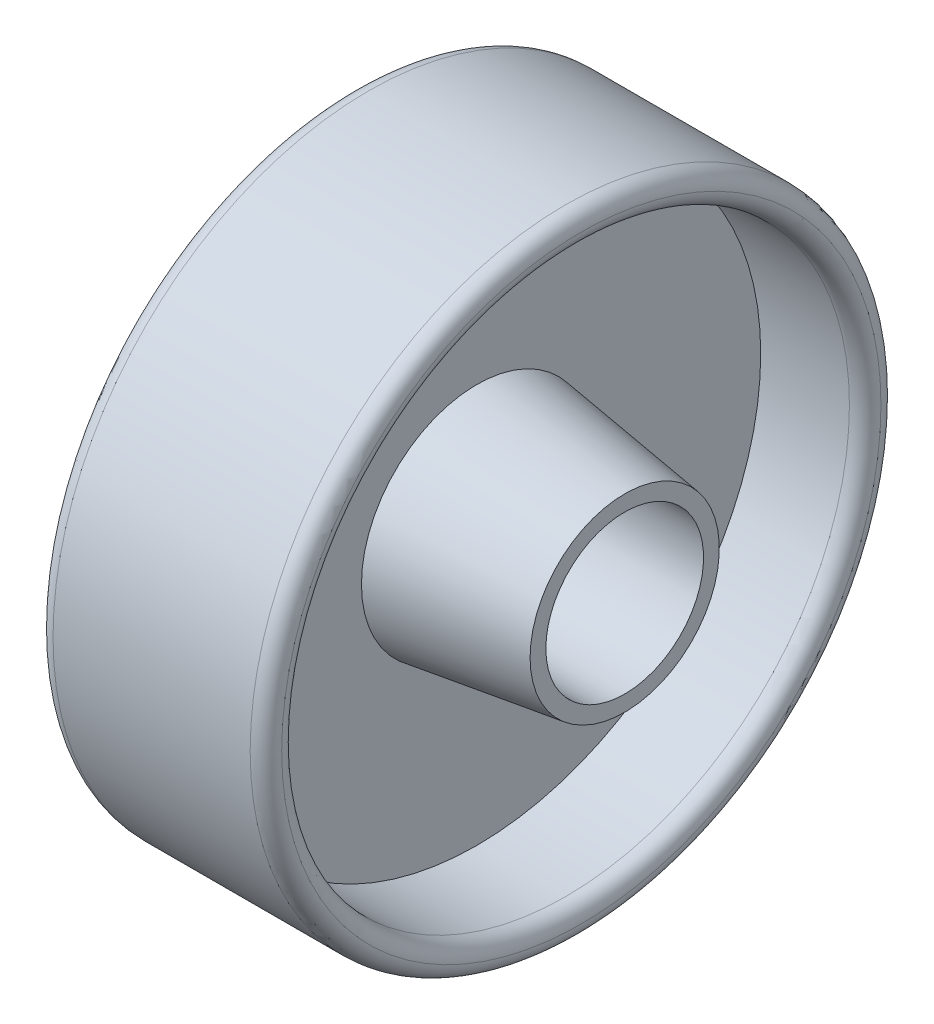
ISO-10303-21;
HEADER;
FILE_DESCRIPTION(('STEP AP214'),'2;1');
FILE_NAME('part.step','',(''),(''),'','','');
FILE_SCHEMA(('AUTOMOTIVE_DESIGN { 1 0 10303 214 1 1 1 1 }'));
ENDSEC;
DATA;
#1=APPLICATION_CONTEXT('core data for automotive mechanical design processes');
#2=APPLICATION_PROTOCOL_DEFINITION('international standard','automotive_design',2000,#1);
#3=PRODUCT_CONTEXT('',#1,'mechanical');
#4=PRODUCT('Part','Part','',(#3));
#5=PRODUCT_RELATED_PRODUCT_CATEGORY('part','',(#4));
#6=PRODUCT_DEFINITION_FORMATION('','',#4);
#7=PRODUCT_DEFINITION_CONTEXT('part definition',#1,'design');
#8=PRODUCT_DEFINITION('design','',#6,#7);
#9=PRODUCT_DEFINITION_SHAPE('','',#8);
#10=(LENGTH_UNIT() NAMED_UNIT(*) SI_UNIT(.MILLI.,.METRE.));
#11=(NAMED_UNIT(*) PLANE_ANGLE_UNIT() SI_UNIT($,.RADIAN.));
#12=(NAMED_UNIT(*) SI_UNIT($,.STERADIAN.) SOLID_ANGLE_UNIT());
#13=UNCERTAINTY_MEASURE_WITH_UNIT(LENGTH_MEASURE(1.E-05),#10,'distance_accuracy_value','');
#14=(GEOMETRIC_REPRESENTATION_CONTEXT(3) GLOBAL_UNCERTAINTY_ASSIGNED_CONTEXT((#13)) GLOBAL_UNIT_ASSIGNED_CONTEXT((#10,
#11,#12)) REPRESENTATION_CONTEXT('',''));
#15=CARTESIAN_POINT('',(0.,0.,0.));
#16=DIRECTION('',(0.,0.,1.));
#17=DIRECTION('',(1.,0.,0.));
#18=AXIS2_PLACEMENT_3D('',#15,#16,#17);
#19=CARTESIAN_POINT('',(20.,10.,0.));
#20=DIRECTION('',(-1.,0.,0.));
#21=DIRECTION('',(0.,0.,1.));
#22=AXIS2_PLACEMENT_3D('',#19,#20,#21);
#23=PLANE('',#22);
#24=CARTESIAN_POINT('',(20.,0.,0.));
#25=DIRECTION('',(-1.,0.,0.));
#26=DIRECTION('',(0.,0.,1.));
#27=AXIS2_PLACEMENT_3D('',#24,#25,#26);
#28=CIRCLE('',#27,12.);
#29=CARTESIAN_POINT('',(20.,0.,12.));
#30=VERTEX_POINT('',#29);
#31=EDGE_CURVE('E49',#30,#30,#28,.T.);
#32=ORIENTED_EDGE('',*,*,#31,.F.);
#33=EDGE_LOOP('',(#32));
#34=FACE_BOUND('',#33,.T.);
#35=CARTESIAN_POINT('',(20.,0.,0.));
#36=DIRECTION('',(-1.,0.,0.));
#37=DIRECTION('',(0.,0.,1.));
#38=AXIS2_PLACEMENT_3D('',#35,#36,#37);
#39=CIRCLE('',#38,10.);
#40=CARTESIAN_POINT('',(20.,0.,10.));
#41=VERTEX_POINT('',#40);
#42=EDGE_CURVE('E135',#41,#41,#39,.T.);
#43=ORIENTED_EDGE('',*,*,#42,.T.);
#44=EDGE_LOOP('',(#43));
#45=FACE_BOUND('',#44,.T.);
#46=ADVANCED_FACE('F31',(#34,#45),#23,.F.);
#47=CARTESIAN_POINT('',(0.,0.,0.));
#48=DIRECTION('',(-1.,0.,0.));
#49=DIRECTION('',(0.,0.,1.));
#50=AXIS2_PLACEMENT_3D('',#47,#48,#49);
#51=CYLINDRICAL_SURFACE('',#50,10.);
#52=ORIENTED_EDGE('',*,*,#42,.F.);
#53=EDGE_LOOP('',(#52));
#54=FACE_BOUND('',#53,.T.);
#55=CARTESIAN_POINT('',(-20.,0.,0.));
#56=DIRECTION('',(-1.,0.,0.));
#57=DIRECTION('',(0.,0.,1.));
#58=AXIS2_PLACEMENT_3D('',#55,#56,#57);
#59=CIRCLE('',#58,10.);
#60=CARTESIAN_POINT('',(-20.,0.,10.));
#61=VERTEX_POINT('',#60);
#62=EDGE_CURVE('E129',#61,#61,#59,.T.);
#63=ORIENTED_EDGE('',*,*,#62,.T.);
#64=EDGE_LOOP('',(#63));
#65=FACE_BOUND('',#64,.T.);
#66=ADVANCED_FACE('F73',(#54,#65),#51,.F.);
#67=CARTESIAN_POINT('',(-20.,10.,0.));
#68=DIRECTION('',(1.,0.,0.));
#69=DIRECTION('',(0.,0.,-1.));
#70=AXIS2_PLACEMENT_3D('',#67,#68,#69);
#71=PLANE('',#70);
#72=ORIENTED_EDGE('',*,*,#62,.F.);
#73=EDGE_LOOP('',(#72));
#74=FACE_BOUND('',#73,.T.);
#75=CARTESIAN_POINT('',(-20.,0.,0.));
#76=DIRECTION('',(-1.,0.,0.));
#77=DIRECTION('',(0.,0.,1.));
#78=AXIS2_PLACEMENT_3D('',#75,#76,#77);
#79=CIRCLE('',#78,12.);
#80=CARTESIAN_POINT('',(-20.,0.,12.));
#81=VERTEX_POINT('',#80);
#82=EDGE_CURVE('E132',#81,#81,#79,.T.);
#83=ORIENTED_EDGE('',*,*,#82,.T.);
#84=EDGE_LOOP('',(#83));
#85=FACE_BOUND('',#84,.T.);
#86=ADVANCED_FACE('F79',(#74,#85),#71,.F.);
#87=CARTESIAN_POINT('',(-1.25,0.,0.));
#88=DIRECTION('',(1.,0.,0.));
#89=DIRECTION('',(0.,0.,-1.));
#90=AXIS2_PLACEMENT_3D('',#87,#88,#89);
#91=CONICAL_SURFACE('',#90,14.6351406506697,0.139626340159539);
#92=ORIENTED_EDGE('',*,*,#82,.F.);
#93=EDGE_LOOP('',(#92));
#94=FACE_BOUND('',#93,.T.);
#95=CARTESIAN_POINT('',(-1.25,0.,0.));
#96=DIRECTION('',(-1.,0.,0.));
#97=DIRECTION('',(0.,0.,1.));
#98=AXIS2_PLACEMENT_3D('',#95,#96,#97);
#99=CIRCLE('',#98,14.6351406506697);
#100=CARTESIAN_POINT('',(-1.25,0.,14.6351406506697));
#101=VERTEX_POINT('',#100);
#102=EDGE_CURVE('E133',#101,#101,#99,.T.);
#103=ORIENTED_EDGE('',*,*,#102,.T.);
#104=EDGE_LOOP('',(#103));
#105=FACE_BOUND('',#104,.T.);
#106=ADVANCED_FACE('F118',(#94,#105),#91,.T.);
#107=CARTESIAN_POINT('',(-1.25,14.6351406506697,0.));
#108=DIRECTION('',(1.,0.,0.));
#109=DIRECTION('',(0.,0.,-1.));
#110=AXIS2_PLACEMENT_3D('',#107,#108,#109);
#111=PLANE('',#110);
#112=ORIENTED_EDGE('',*,*,#102,.F.);
#113=EDGE_LOOP('',(#112));
#114=FACE_BOUND('',#113,.T.);
#115=CARTESIAN_POINT('',(-1.25,0.,0.));
#116=DIRECTION('',(-1.,0.,0.));
#117=DIRECTION('',(0.,0.,1.));
#118=AXIS2_PLACEMENT_3D('',#115,#116,#117);
#119=CIRCLE('',#118,36.);
#120=CARTESIAN_POINT('',(-1.25,0.,36.));
#121=VERTEX_POINT('',#120);
#122=EDGE_CURVE('E138',#121,#121,#119,.T.);
#123=ORIENTED_EDGE('',*,*,#122,.T.);
#124=EDGE_LOOP('',(#123));
#125=FACE_BOUND('',#124,.T.);
#126=ADVANCED_FACE('F114',(#114,#125),#111,.F.);
#127=CARTESIAN_POINT('',(0.,0.,0.));
#128=DIRECTION('',(-1.,0.,0.));
#129=DIRECTION('',(0.,0.,1.));
#130=AXIS2_PLACEMENT_3D('',#127,#128,#129);
#131=CYLINDRICAL_SURFACE('',#130,36.);
#132=CARTESIAN_POINT('',(-12.5,0.,0.));
#133=DIRECTION('',(1.,0.,0.));
#134=DIRECTION('',(0.,0.,-1.));
#135=AXIS2_PLACEMENT_3D('',#132,#133,#134);
#136=CIRCLE('',#135,36.);
#137=CARTESIAN_POINT('',(-12.5,0.,-36.));
#138=VERTEX_POINT('',#137);
#139=EDGE_CURVE('E44',#138,#138,#136,.F.);
#140=ORIENTED_EDGE('',*,*,#139,.T.);
#141=EDGE_LOOP('',(#140));
#142=FACE_BOUND('',#141,.T.);
#143=ORIENTED_EDGE('',*,*,#122,.F.);
#144=EDGE_LOOP('',(#143));
#145=FACE_BOUND('',#144,.T.);
#146=ADVANCED_FACE('F111',(#142,#145),#131,.F.);
#147=CARTESIAN_POINT('',(0.,0.,0.));
#148=DIRECTION('',(-1.,0.,0.));
#149=DIRECTION('',(0.,0.,1.));
#150=AXIS2_PLACEMENT_3D('',#147,#148,#149);
#151=CYLINDRICAL_SURFACE('',#150,40.);
#152=CARTESIAN_POINT('',(12.5,0.,0.));
#153=DIRECTION('',(-1.,0.,0.));
#154=DIRECTION('',(0.,0.,1.));
#155=AXIS2_PLACEMENT_3D('',#152,#153,#154);
#156=CIRCLE('',#155,40.);
#157=CARTESIAN_POINT('',(12.5,0.,40.));
#158=VERTEX_POINT('',#157);
#159=EDGE_CURVE('E10',#158,#158,#156,.T.);
#160=ORIENTED_EDGE('',*,*,#159,.T.);
#161=EDGE_LOOP('',(#160));
#162=FACE_BOUND('',#161,.T.);
#163=CARTESIAN_POINT('',(-12.5,0.,0.));
#164=DIRECTION('',(1.,0.,0.));
#165=DIRECTION('',(0.,0.,-1.));
#166=AXIS2_PLACEMENT_3D('',#163,#164,#165);
#167=CIRCLE('',#166,40.);
#168=CARTESIAN_POINT('',(-12.5,0.,-40.));
#169=VERTEX_POINT('',#168);
#170=EDGE_CURVE('E39',#169,#169,#167,.T.);
#171=ORIENTED_EDGE('',*,*,#170,.T.);
#172=EDGE_LOOP('',(#171));
#173=FACE_BOUND('',#172,.T.);
#174=ADVANCED_FACE('F107',(#162,#173),#151,.T.);
#175=CARTESIAN_POINT('',(0.,0.,0.));
#176=DIRECTION('',(-1.,0.,0.));
#177=DIRECTION('',(0.,0.,1.));
#178=AXIS2_PLACEMENT_3D('',#175,#176,#177);
#179=CYLINDRICAL_SURFACE('',#178,36.);
#180=CARTESIAN_POINT('',(12.5,0.,0.));
#181=DIRECTION('',(-1.,0.,0.));
#182=DIRECTION('',(0.,0.,1.));
#183=AXIS2_PLACEMENT_3D('',#180,#181,#182);
#184=CIRCLE('',#183,36.);
#185=CARTESIAN_POINT('',(12.5,0.,36.));
#186=VERTEX_POINT('',#185);
#187=EDGE_CURVE('E144',#186,#186,#184,.F.);
#188=ORIENTED_EDGE('',*,*,#187,.T.);
#189=EDGE_LOOP('',(#188));
#190=FACE_BOUND('',#189,.T.);
#191=CARTESIAN_POINT('',(1.25,0.,0.));
#192=DIRECTION('',(-1.,0.,0.));
#193=DIRECTION('',(0.,0.,1.));
#194=AXIS2_PLACEMENT_3D('',#191,#192,#193);
#195=CIRCLE('',#194,36.);
#196=CARTESIAN_POINT('',(1.25,0.,36.));
#197=VERTEX_POINT('',#196);
#198=EDGE_CURVE('E152',#197,#197,#195,.T.);
#199=ORIENTED_EDGE('',*,*,#198,.T.);
#200=EDGE_LOOP('',(#199));
#201=FACE_BOUND('',#200,.T.);
#202=ADVANCED_FACE('F99',(#190,#201),#179,.F.);
#203=CARTESIAN_POINT('',(1.25,14.6351406506697,0.));
#204=DIRECTION('',(-1.,0.,0.));
#205=DIRECTION('',(0.,0.,1.));
#206=AXIS2_PLACEMENT_3D('',#203,#204,#205);
#207=PLANE('',#206);
#208=ORIENTED_EDGE('',*,*,#198,.F.);
#209=EDGE_LOOP('',(#208));
#210=FACE_BOUND('',#209,.T.);
#211=CARTESIAN_POINT('',(1.25,0.,0.));
#212=DIRECTION('',(-1.,0.,0.));
#213=DIRECTION('',(0.,0.,1.));
#214=AXIS2_PLACEMENT_3D('',#211,#212,#213);
#215=CIRCLE('',#214,14.6351406506697);
#216=CARTESIAN_POINT('',(1.25,0.,14.6351406506697));
#217=VERTEX_POINT('',#216);
#218=EDGE_CURVE('E53',#217,#217,#215,.T.);
#219=ORIENTED_EDGE('',*,*,#218,.T.);
#220=EDGE_LOOP('',(#219));
#221=FACE_BOUND('',#220,.T.);
#222=ADVANCED_FACE('F92',(#210,#221),#207,.F.);
#223=CARTESIAN_POINT('',(20.,0.,0.));
#224=DIRECTION('',(-1.,0.,0.));
#225=DIRECTION('',(0.,0.,1.));
#226=AXIS2_PLACEMENT_3D('',#223,#224,#225);
#227=CONICAL_SURFACE('',#226,12.,0.139626340159539);
#228=ORIENTED_EDGE('',*,*,#218,.F.);
#229=EDGE_LOOP('',(#228));
#230=FACE_BOUND('',#229,.T.);
#231=ORIENTED_EDGE('',*,*,#31,.T.);
#232=EDGE_LOOP('',(#231));
#233=FACE_BOUND('',#232,.T.);
#234=ADVANCED_FACE('F87',(#230,#233),#227,.T.);
#235=CARTESIAN_POINT('',(12.5,0.,0.));
#236=DIRECTION('',(-1.,0.,0.));
#237=DIRECTION('',(0.,0.,1.));
#238=AXIS2_PLACEMENT_3D('',#235,#236,#237);
#239=TOROIDAL_SURFACE('',#238,38.,2.);
#240=ORIENTED_EDGE('',*,*,#159,.F.);
#241=EDGE_LOOP('',(#240));
#242=FACE_BOUND('',#241,.T.);
#243=CARTESIAN_POINT('',(14.5,0.,0.));
#244=DIRECTION('',(-1.,0.,0.));
#245=DIRECTION('',(0.,0.,1.));
#246=AXIS2_PLACEMENT_3D('',#243,#244,#245);
#247=CIRCLE('',#246,38.);
#248=CARTESIAN_POINT('',(14.5,0.,38.));
#249=VERTEX_POINT('',#248);
#250=EDGE_CURVE('E47',#249,#249,#247,.F.);
#251=ORIENTED_EDGE('',*,*,#250,.F.);
#252=EDGE_LOOP('',(#251));
#253=FACE_BOUND('',#252,.T.);
#254=ADVANCED_FACE('F68',(#242,#253),#239,.T.);
#255=CARTESIAN_POINT('',(12.5,0.,0.));
#256=DIRECTION('',(-1.,0.,0.));
#257=DIRECTION('',(0.,0.,1.));
#258=AXIS2_PLACEMENT_3D('',#255,#256,#257);
#259=TOROIDAL_SURFACE('',#258,38.,2.);
#260=ORIENTED_EDGE('',*,*,#187,.F.);
#261=EDGE_LOOP('',(#260));
#262=FACE_BOUND('',#261,.T.);
#263=ORIENTED_EDGE('',*,*,#250,.T.);
#264=EDGE_LOOP('',(#263));
#265=FACE_BOUND('',#264,.T.);
#266=ADVANCED_FACE('F62',(#262,#265),#259,.T.);
#267=CARTESIAN_POINT('',(-12.5,0.,0.));
#268=DIRECTION('',(1.,0.,0.));
#269=DIRECTION('',(0.,0.,-1.));
#270=AXIS2_PLACEMENT_3D('',#267,#268,#269);
#271=TOROIDAL_SURFACE('',#270,38.,2.);
#272=ORIENTED_EDGE('',*,*,#170,.F.);
#273=EDGE_LOOP('',(#272));
#274=FACE_BOUND('',#273,.T.);
#275=CARTESIAN_POINT('',(-14.5,0.,0.));
#276=DIRECTION('',(1.,0.,0.));
#277=DIRECTION('',(0.,0.,-1.));
#278=AXIS2_PLACEMENT_3D('',#275,#276,#277);
#279=CIRCLE('',#278,38.);
#280=CARTESIAN_POINT('',(-14.5,0.,-38.));
#281=VERTEX_POINT('',#280);
#282=EDGE_CURVE('E35',#281,#281,#279,.F.);
#283=ORIENTED_EDGE('',*,*,#282,.F.);
#284=EDGE_LOOP('',(#283));
#285=FACE_BOUND('',#284,.T.);
#286=ADVANCED_FACE('F33',(#274,#285),#271,.T.);
#287=CARTESIAN_POINT('',(-12.5,0.,0.));
#288=DIRECTION('',(1.,0.,0.));
#289=DIRECTION('',(0.,0.,-1.));
#290=AXIS2_PLACEMENT_3D('',#287,#288,#289);
#291=TOROIDAL_SURFACE('',#290,38.,2.);
#292=ORIENTED_EDGE('',*,*,#282,.T.);
#293=EDGE_LOOP('',(#292));
#294=FACE_BOUND('',#293,.T.);
#295=ORIENTED_EDGE('',*,*,#139,.F.);
#296=EDGE_LOOP('',(#295));
#297=FACE_BOUND('',#296,.T.);
#298=ADVANCED_FACE('F58',(#294,#297),#291,.T.);
#299=CLOSED_SHELL('',(#46,#66,#86,#106,#126,#146,#174,#202,#222,#234,#254,#266,#286,#298));
#300=MANIFOLD_SOLID_BREP('B2',#299);
#301=ADVANCED_BREP_SHAPE_REPRESENTATION('',(#18,#300),#14);
#302=SHAPE_DEFINITION_REPRESENTATION(#9,#301);
ENDSEC;
END-ISO-10303-21;
